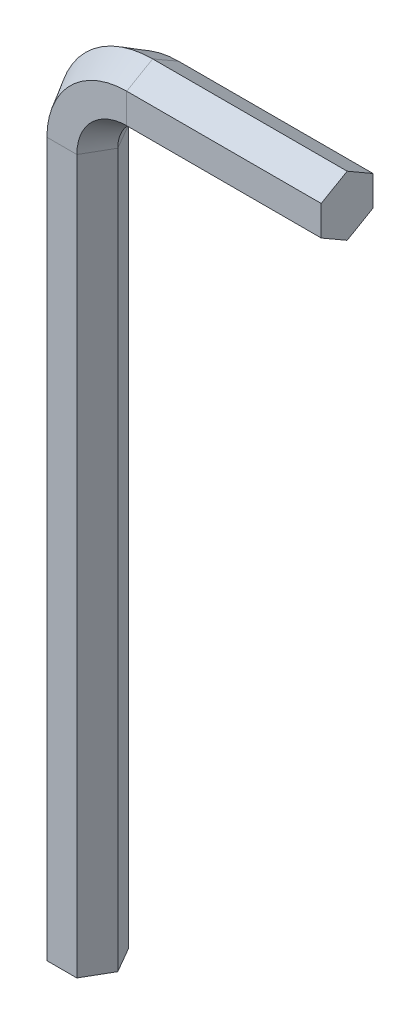
ISO-10303-21;
HEADER;
FILE_DESCRIPTION(('STEP AP214'),'2;1');
FILE_NAME('part.step','',(''),(''),'','','');
FILE_SCHEMA(('AUTOMOTIVE_DESIGN { 1 0 10303 214 1 1 1 1 }'));
ENDSEC;
DATA;
#1=APPLICATION_CONTEXT('core data for automotive mechanical design processes');
#2=APPLICATION_PROTOCOL_DEFINITION('international standard','automotive_design',2000,#1);
#3=PRODUCT_CONTEXT('',#1,'mechanical');
#4=PRODUCT('Part','Part','',(#3));
#5=PRODUCT_RELATED_PRODUCT_CATEGORY('part','',(#4));
#6=PRODUCT_DEFINITION_FORMATION('','',#4);
#7=PRODUCT_DEFINITION_CONTEXT('part definition',#1,'design');
#8=PRODUCT_DEFINITION('design','',#6,#7);
#9=PRODUCT_DEFINITION_SHAPE('','',#8);
#10=(LENGTH_UNIT() NAMED_UNIT(*) SI_UNIT(.MILLI.,.METRE.));
#11=(NAMED_UNIT(*) PLANE_ANGLE_UNIT() SI_UNIT($,.RADIAN.));
#12=(NAMED_UNIT(*) SI_UNIT($,.STERADIAN.) SOLID_ANGLE_UNIT());
#13=UNCERTAINTY_MEASURE_WITH_UNIT(LENGTH_MEASURE(1.E-05),#10,'distance_accuracy_value','');
#14=(GEOMETRIC_REPRESENTATION_CONTEXT(3) GLOBAL_UNCERTAINTY_ASSIGNED_CONTEXT((#13)) GLOBAL_UNIT_ASSIGNED_CONTEXT((#10,
#11,#12)) REPRESENTATION_CONTEXT('',''));
#15=CARTESIAN_POINT('',(0.,0.,0.));
#16=DIRECTION('',(0.,0.,1.));
#17=DIRECTION('',(1.,0.,0.));
#18=AXIS2_PLACEMENT_3D('',#15,#16,#17);
#19=CARTESIAN_POINT('',(0.,0.,0.));
#20=DIRECTION('',(0.,1.,0.));
#21=DIRECTION('',(0.,0.,1.));
#22=AXIS2_PLACEMENT_3D('',#19,#20,#21);
#23=PLANE('',#22);
#24=DIRECTION('',(0.499999999999997,0.,-0.86602540378444));
#25=VECTOR('',#24,1.);
#26=CARTESIAN_POINT('',(2.30940107675852,0.,3.99999999999999));
#27=LINE('',#26,#25);
#28=CARTESIAN_POINT('',(2.30940107675852,0.,3.99999999999999));
#29=VERTEX_POINT('',#28);
#30=CARTESIAN_POINT('',(4.61880215351701,0.,0.));
#31=VERTEX_POINT('',#30);
#32=EDGE_CURVE('E198',#29,#31,#27,.T.);
#33=ORIENTED_EDGE('',*,*,#32,.F.);
#34=DIRECTION('',(1.,0.,0.));
#35=VECTOR('',#34,1.);
#36=CARTESIAN_POINT('',(-2.30940107675849,0.,4.00000000000001));
#37=LINE('',#36,#35);
#38=CARTESIAN_POINT('',(-2.30940107675849,0.,4.00000000000001));
#39=VERTEX_POINT('',#38);
#40=EDGE_CURVE('E260',#39,#29,#37,.T.);
#41=ORIENTED_EDGE('',*,*,#40,.F.);
#42=DIRECTION('',(0.500000000000003,0.,0.866025403784437));
#43=VECTOR('',#42,1.);
#44=CARTESIAN_POINT('',(-4.61880215351701,0.,0.));
#45=LINE('',#44,#43);
#46=CARTESIAN_POINT('',(-4.61880215351701,0.,0.));
#47=VERTEX_POINT('',#46);
#48=EDGE_CURVE('E240',#47,#39,#45,.T.);
#49=ORIENTED_EDGE('',*,*,#48,.F.);
#50=DIRECTION('',(-0.499999999999996,0.,0.866025403784441));
#51=VECTOR('',#50,1.);
#52=CARTESIAN_POINT('',(-2.30940107675852,0.,-3.99999999999999));
#53=LINE('',#52,#51);
#54=CARTESIAN_POINT('',(-2.30940107675852,0.,-3.99999999999999));
#55=VERTEX_POINT('',#54);
#56=EDGE_CURVE('E145',#55,#47,#53,.T.);
#57=ORIENTED_EDGE('',*,*,#56,.F.);
#58=DIRECTION('',(-1.,0.,0.));
#59=VECTOR('',#58,1.);
#60=CARTESIAN_POINT('',(2.30940107675849,0.,-4.00000000000001));
#61=LINE('',#60,#59);
#62=CARTESIAN_POINT('',(2.30940107675849,0.,-4.00000000000001));
#63=VERTEX_POINT('',#62);
#64=EDGE_CURVE('E149',#63,#55,#61,.T.);
#65=ORIENTED_EDGE('',*,*,#64,.F.);
#66=DIRECTION('',(-0.500000000000003,0.,-0.866025403784437));
#67=VECTOR('',#66,1.);
#68=CARTESIAN_POINT('',(4.61880215351701,0.,0.));
#69=LINE('',#68,#67);
#70=EDGE_CURVE('E154',#31,#63,#69,.T.);
#71=ORIENTED_EDGE('',*,*,#70,.F.);
#72=EDGE_LOOP('',(#33,#41,#49,#57,#65,#71));
#73=FACE_BOUND('',#72,.T.);
#74=ADVANCED_FACE('F43',(#73),#23,.F.);
#75=CARTESIAN_POINT('',(40.,120.,0.));
#76=DIRECTION('',(1.,0.,0.));
#77=DIRECTION('',(0.,0.,1.));
#78=AXIS2_PLACEMENT_3D('',#75,#76,#77);
#79=PLANE('',#78);
#80=DIRECTION('',(0.,-0.499999999999997,-0.86602540378444));
#81=VECTOR('',#80,1.);
#82=CARTESIAN_POINT('',(40.,117.690598923241,3.99999999999999));
#83=LINE('',#82,#81);
#84=CARTESIAN_POINT('',(40.,117.690598923241,3.99999999999999));
#85=VERTEX_POINT('',#84);
#86=CARTESIAN_POINT('',(40.,115.381197846483,0.));
#87=VERTEX_POINT('',#86);
#88=EDGE_CURVE('E165',#85,#87,#83,.T.);
#89=ORIENTED_EDGE('',*,*,#88,.T.);
#90=DIRECTION('',(0.,0.500000000000003,-0.866025403784437));
#91=VECTOR('',#90,1.);
#92=CARTESIAN_POINT('',(40.,115.381197846483,0.));
#93=LINE('',#92,#91);
#94=CARTESIAN_POINT('',(40.,117.690598923242,-4.00000000000001));
#95=VERTEX_POINT('',#94);
#96=EDGE_CURVE('E168',#87,#95,#93,.T.);
#97=ORIENTED_EDGE('',*,*,#96,.T.);
#98=DIRECTION('',(0.,1.,0.));
#99=VECTOR('',#98,1.);
#100=CARTESIAN_POINT('',(40.,117.690598923242,-4.00000000000001));
#101=LINE('',#100,#99);
#102=CARTESIAN_POINT('',(40.,122.309401076759,-3.99999999999999));
#103=VERTEX_POINT('',#102);
#104=EDGE_CURVE('E218',#95,#103,#101,.T.);
#105=ORIENTED_EDGE('',*,*,#104,.T.);
#106=DIRECTION('',(0.,0.499999999999996,0.866025403784441));
#107=VECTOR('',#106,1.);
#108=CARTESIAN_POINT('',(40.,122.309401076759,-3.99999999999999));
#109=LINE('',#108,#107);
#110=CARTESIAN_POINT('',(40.,124.618802153517,0.));
#111=VERTEX_POINT('',#110);
#112=EDGE_CURVE('E63',#103,#111,#109,.T.);
#113=ORIENTED_EDGE('',*,*,#112,.T.);
#114=DIRECTION('',(0.,-0.500000000000003,0.866025403784437));
#115=VECTOR('',#114,1.);
#116=CARTESIAN_POINT('',(40.,124.618802153517,0.));
#117=LINE('',#116,#115);
#118=CARTESIAN_POINT('',(40.,122.309401076759,4.00000000000001));
#119=VERTEX_POINT('',#118);
#120=EDGE_CURVE('E57',#111,#119,#117,.T.);
#121=ORIENTED_EDGE('',*,*,#120,.T.);
#122=DIRECTION('',(0.,-1.,0.));
#123=VECTOR('',#122,1.);
#124=CARTESIAN_POINT('',(40.,122.309401076759,4.00000000000001));
#125=LINE('',#124,#123);
#126=EDGE_CURVE('E11',#119,#85,#125,.T.);
#127=ORIENTED_EDGE('',*,*,#126,.T.);
#128=EDGE_LOOP('',(#89,#97,#105,#113,#121,#127));
#129=FACE_BOUND('',#128,.T.);
#130=ADVANCED_FACE('F167',(#129),#79,.T.);
#131=CARTESIAN_POINT('',(2.30940107675852,0.,3.99999999999999));
#132=DIRECTION('',(0.86602540378444,0.,0.499999999999997));
#133=DIRECTION('',(0.499999999999997,0.,-0.86602540378444));
#134=AXIS2_PLACEMENT_3D('',#131,#132,#133);
#135=PLANE('',#134);
#136=DIRECTION('',(0.,1.,0.));
#137=VECTOR('',#136,1.);
#138=CARTESIAN_POINT('',(4.61880215351701,0.,0.));
#139=LINE('',#138,#137);
#140=CARTESIAN_POINT('',(4.61880215351701,110.,0.));
#141=VERTEX_POINT('',#140);
#142=EDGE_CURVE('E204',#31,#141,#139,.T.);
#143=ORIENTED_EDGE('',*,*,#142,.T.);
#144=DIRECTION('',(0.499999999999997,0.,-0.86602540378444));
#145=VECTOR('',#144,1.);
#146=CARTESIAN_POINT('',(2.30940107675852,110.,3.99999999999999));
#147=LINE('',#146,#145);
#148=CARTESIAN_POINT('',(2.30940107675852,110.,3.99999999999999));
#149=VERTEX_POINT('',#148);
#150=EDGE_CURVE('E305',#149,#141,#147,.T.);
#151=ORIENTED_EDGE('',*,*,#150,.F.);
#152=DIRECTION('',(0.,1.,0.));
#153=VECTOR('',#152,1.);
#154=CARTESIAN_POINT('',(2.30940107675852,0.,3.99999999999999));
#155=LINE('',#154,#153);
#156=EDGE_CURVE('E281',#29,#149,#155,.T.);
#157=ORIENTED_EDGE('',*,*,#156,.F.);
#158=ORIENTED_EDGE('',*,*,#32,.T.);
#159=EDGE_LOOP('',(#143,#151,#157,#158));
#160=FACE_BOUND('',#159,.T.);
#161=ADVANCED_FACE('F315',(#160),#135,.T.);
#162=CARTESIAN_POINT('',(4.61880215351701,0.,0.));
#163=DIRECTION('',(0.866025403784437,0.,-0.500000000000003));
#164=DIRECTION('',(-0.500000000000003,0.,-0.866025403784437));
#165=AXIS2_PLACEMENT_3D('',#162,#163,#164);
#166=PLANE('',#165);
#167=DIRECTION('',(0.,1.,0.));
#168=VECTOR('',#167,1.);
#169=CARTESIAN_POINT('',(2.30940107675849,0.,-4.00000000000001));
#170=LINE('',#169,#168);
#171=CARTESIAN_POINT('',(2.30940107675849,110.,-4.00000000000001));
#172=VERTEX_POINT('',#171);
#173=EDGE_CURVE('E203',#63,#172,#170,.T.);
#174=ORIENTED_EDGE('',*,*,#173,.T.);
#175=DIRECTION('',(-0.500000000000003,0.,-0.866025403784437));
#176=VECTOR('',#175,1.);
#177=CARTESIAN_POINT('',(4.61880215351701,110.,0.));
#178=LINE('',#177,#176);
#179=EDGE_CURVE('E199',#141,#172,#178,.T.);
#180=ORIENTED_EDGE('',*,*,#179,.F.);
#181=ORIENTED_EDGE('',*,*,#142,.F.);
#182=ORIENTED_EDGE('',*,*,#70,.T.);
#183=EDGE_LOOP('',(#174,#180,#181,#182));
#184=FACE_BOUND('',#183,.T.);
#185=ADVANCED_FACE('F318',(#184),#166,.T.);
#186=CARTESIAN_POINT('',(2.30940107675849,0.,-4.00000000000001));
#187=DIRECTION('',(0.,0.,-1.));
#188=DIRECTION('',(-1.,0.,0.));
#189=AXIS2_PLACEMENT_3D('',#186,#187,#188);
#190=PLANE('',#189);
#191=DIRECTION('',(0.,1.,0.));
#192=VECTOR('',#191,1.);
#193=CARTESIAN_POINT('',(-2.30940107675852,0.,-3.99999999999999));
#194=LINE('',#193,#192);
#195=CARTESIAN_POINT('',(-2.30940107675852,110.,-3.99999999999999));
#196=VERTEX_POINT('',#195);
#197=EDGE_CURVE('E223',#55,#196,#194,.T.);
#198=ORIENTED_EDGE('',*,*,#197,.T.);
#199=DIRECTION('',(-1.,0.,0.));
#200=VECTOR('',#199,1.);
#201=CARTESIAN_POINT('',(2.30940107675849,110.,-4.00000000000001));
#202=LINE('',#201,#200);
#203=EDGE_CURVE('E208',#172,#196,#202,.T.);
#204=ORIENTED_EDGE('',*,*,#203,.F.);
#205=ORIENTED_EDGE('',*,*,#173,.F.);
#206=ORIENTED_EDGE('',*,*,#64,.T.);
#207=EDGE_LOOP('',(#198,#204,#205,#206));
#208=FACE_BOUND('',#207,.T.);
#209=ADVANCED_FACE('F375',(#208),#190,.T.);
#210=CARTESIAN_POINT('',(-2.30940107675852,0.,-3.99999999999999));
#211=DIRECTION('',(-0.866025403784441,0.,-0.499999999999996));
#212=DIRECTION('',(-0.499999999999996,0.,0.866025403784441));
#213=AXIS2_PLACEMENT_3D('',#210,#211,#212);
#214=PLANE('',#213);
#215=DIRECTION('',(0.,1.,0.));
#216=VECTOR('',#215,1.);
#217=CARTESIAN_POINT('',(-4.61880215351701,0.,0.));
#218=LINE('',#217,#216);
#219=CARTESIAN_POINT('',(-4.61880215351701,110.,0.));
#220=VERTEX_POINT('',#219);
#221=EDGE_CURVE('E243',#47,#220,#218,.T.);
#222=ORIENTED_EDGE('',*,*,#221,.T.);
#223=DIRECTION('',(-0.499999999999996,0.,0.866025403784441));
#224=VECTOR('',#223,1.);
#225=CARTESIAN_POINT('',(-2.30940107675852,110.,-3.99999999999999));
#226=LINE('',#225,#224);
#227=EDGE_CURVE('E227',#196,#220,#226,.T.);
#228=ORIENTED_EDGE('',*,*,#227,.F.);
#229=ORIENTED_EDGE('',*,*,#197,.F.);
#230=ORIENTED_EDGE('',*,*,#56,.T.);
#231=EDGE_LOOP('',(#222,#228,#229,#230));
#232=FACE_BOUND('',#231,.T.);
#233=ADVANCED_FACE('F384',(#232),#214,.T.);
#234=CARTESIAN_POINT('',(-4.61880215351701,0.,0.));
#235=DIRECTION('',(-0.866025403784437,0.,0.500000000000003));
#236=DIRECTION('',(0.500000000000003,0.,0.866025403784437));
#237=AXIS2_PLACEMENT_3D('',#234,#235,#236);
#238=PLANE('',#237);
#239=DIRECTION('',(0.,1.,0.));
#240=VECTOR('',#239,1.);
#241=CARTESIAN_POINT('',(-2.30940107675849,0.,4.00000000000001));
#242=LINE('',#241,#240);
#243=CARTESIAN_POINT('',(-2.30940107675849,110.,4.00000000000001));
#244=VERTEX_POINT('',#243);
#245=EDGE_CURVE('E263',#39,#244,#242,.T.);
#246=ORIENTED_EDGE('',*,*,#245,.T.);
#247=DIRECTION('',(0.500000000000003,0.,0.866025403784437));
#248=VECTOR('',#247,1.);
#249=CARTESIAN_POINT('',(-4.61880215351701,110.,0.));
#250=LINE('',#249,#248);
#251=EDGE_CURVE('E247',#220,#244,#250,.T.);
#252=ORIENTED_EDGE('',*,*,#251,.F.);
#253=ORIENTED_EDGE('',*,*,#221,.F.);
#254=ORIENTED_EDGE('',*,*,#48,.T.);
#255=EDGE_LOOP('',(#246,#252,#253,#254));
#256=FACE_BOUND('',#255,.T.);
#257=ADVANCED_FACE('F395',(#256),#238,.T.);
#258=CARTESIAN_POINT('',(-2.30940107675849,0.,4.00000000000001));
#259=DIRECTION('',(0.,0.,1.));
#260=DIRECTION('',(1.,0.,0.));
#261=AXIS2_PLACEMENT_3D('',#258,#259,#260);
#262=PLANE('',#261);
#263=DIRECTION('',(1.,0.,0.));
#264=VECTOR('',#263,1.);
#265=CARTESIAN_POINT('',(-2.30940107675849,110.,4.00000000000001));
#266=LINE('',#265,#264);
#267=EDGE_CURVE('E267',#244,#149,#266,.T.);
#268=ORIENTED_EDGE('',*,*,#267,.F.);
#269=ORIENTED_EDGE('',*,*,#245,.F.);
#270=ORIENTED_EDGE('',*,*,#40,.T.);
#271=ORIENTED_EDGE('',*,*,#156,.T.);
#272=EDGE_LOOP('',(#268,#269,#270,#271));
#273=FACE_BOUND('',#272,.T.);
#274=ADVANCED_FACE('F331',(#273),#262,.T.);
#275=CARTESIAN_POINT('',(10.,110.,3.99999999999999));
#276=DIRECTION('',(0.,0.,1.));
#277=DIRECTION('',(1.,0.,0.));
#278=AXIS2_PLACEMENT_3D('',#275,#276,#277);
#279=CONICAL_SURFACE('',#278,7.69059892324148,0.523598775598296);
#280=CARTESIAN_POINT('',(10.,110.,0.));
#281=DIRECTION('',(0.,0.,-1.));
#282=DIRECTION('',(-1.,0.,0.));
#283=AXIS2_PLACEMENT_3D('',#280,#281,#282);
#284=CIRCLE('',#283,5.38119784648299);
#285=CARTESIAN_POINT('',(10.,115.381197846483,0.));
#286=VERTEX_POINT('',#285);
#287=EDGE_CURVE('E212',#141,#286,#284,.T.);
#288=ORIENTED_EDGE('',*,*,#287,.T.);
#289=DIRECTION('',(0.,-0.499999999999997,-0.86602540378444));
#290=VECTOR('',#289,1.);
#291=CARTESIAN_POINT('',(10.0000000000001,117.690598923241,3.99999999999999));
#292=LINE('',#291,#290);
#293=CARTESIAN_POINT('',(10.0000000000001,117.690598923241,3.99999999999999));
#294=VERTEX_POINT('',#293);
#295=EDGE_CURVE('E188',#294,#286,#292,.T.);
#296=ORIENTED_EDGE('',*,*,#295,.F.);
#297=CARTESIAN_POINT('',(10.,110.,3.99999999999999));
#298=DIRECTION('',(0.,0.,-1.));
#299=DIRECTION('',(-1.,0.,0.));
#300=AXIS2_PLACEMENT_3D('',#297,#298,#299);
#301=CIRCLE('',#300,7.69059892324148);
#302=EDGE_CURVE('E284',#149,#294,#301,.T.);
#303=ORIENTED_EDGE('',*,*,#302,.F.);
#304=ORIENTED_EDGE('',*,*,#150,.T.);
#305=EDGE_LOOP('',(#288,#296,#303,#304));
#306=FACE_BOUND('',#305,.T.);
#307=ADVANCED_FACE('F291',(#306),#279,.F.);
#308=CARTESIAN_POINT('',(10.,110.,0.));
#309=DIRECTION('',(0.,0.,-1.));
#310=DIRECTION('',(-1.,0.,0.));
#311=AXIS2_PLACEMENT_3D('',#308,#309,#310);
#312=CONICAL_SURFACE('',#311,5.38119784648299,0.523598775598303);
#313=CARTESIAN_POINT('',(10.,110.,-4.00000000000001));
#314=DIRECTION('',(0.,0.,-1.));
#315=DIRECTION('',(-1.,0.,0.));
#316=AXIS2_PLACEMENT_3D('',#313,#314,#315);
#317=CIRCLE('',#316,7.69059892324151);
#318=CARTESIAN_POINT('',(10.0000000000001,117.690598923242,-4.00000000000001));
#319=VERTEX_POINT('',#318);
#320=EDGE_CURVE('E132',#172,#319,#317,.T.);
#321=ORIENTED_EDGE('',*,*,#320,.T.);
#322=DIRECTION('',(0.,0.500000000000003,-0.866025403784437));
#323=VECTOR('',#322,1.);
#324=CARTESIAN_POINT('',(10.,115.381197846483,0.));
#325=LINE('',#324,#323);
#326=EDGE_CURVE('E209',#286,#319,#325,.T.);
#327=ORIENTED_EDGE('',*,*,#326,.F.);
#328=ORIENTED_EDGE('',*,*,#287,.F.);
#329=ORIENTED_EDGE('',*,*,#179,.T.);
#330=EDGE_LOOP('',(#321,#327,#328,#329));
#331=FACE_BOUND('',#330,.T.);
#332=ADVANCED_FACE('F321',(#331),#312,.F.);
#333=CARTESIAN_POINT('',(2.30940107675849,110.,-4.));
#334=DIRECTION('',(0.,0.,-1.));
#335=DIRECTION('',(-1.,0.,0.));
#336=AXIS2_PLACEMENT_3D('',#333,#334,#335);
#337=PLANE('',#336);
#338=CARTESIAN_POINT('',(10.,110.,-3.99999999999999));
#339=DIRECTION('',(0.,0.,-1.));
#340=DIRECTION('',(-1.,0.,0.));
#341=AXIS2_PLACEMENT_3D('',#338,#339,#340);
#342=CIRCLE('',#341,12.3094010767585);
#343=CARTESIAN_POINT('',(10.0000000000001,122.309401076759,-3.99999999999999));
#344=VERTEX_POINT('',#343);
#345=EDGE_CURVE('E123',#196,#344,#342,.T.);
#346=ORIENTED_EDGE('',*,*,#345,.T.);
#347=DIRECTION('',(0.,1.,0.));
#348=VECTOR('',#347,1.);
#349=CARTESIAN_POINT('',(10.0000000000001,117.690598923242,-4.00000000000001));
#350=LINE('',#349,#348);
#351=EDGE_CURVE('E214',#319,#344,#350,.T.);
#352=ORIENTED_EDGE('',*,*,#351,.F.);
#353=ORIENTED_EDGE('',*,*,#320,.F.);
#354=ORIENTED_EDGE('',*,*,#203,.T.);
#355=EDGE_LOOP('',(#346,#352,#353,#354));
#356=FACE_BOUND('',#355,.T.);
#357=ADVANCED_FACE('F323',(#356),#337,.T.);
#358=CARTESIAN_POINT('',(10.,110.,-3.99999999999999));
#359=DIRECTION('',(0.,0.,1.));
#360=DIRECTION('',(1.,0.,0.));
#361=AXIS2_PLACEMENT_3D('',#358,#359,#360);
#362=CONICAL_SURFACE('',#361,12.3094010767585,0.523598775598295);
#363=CARTESIAN_POINT('',(10.,110.,0.));
#364=DIRECTION('',(0.,0.,-1.));
#365=DIRECTION('',(-1.,0.,0.));
#366=AXIS2_PLACEMENT_3D('',#363,#364,#365);
#367=CIRCLE('',#366,14.618802153517);
#368=CARTESIAN_POINT('',(10.0000000000001,124.618802153517,0.));
#369=VERTEX_POINT('',#368);
#370=EDGE_CURVE('E116',#220,#369,#367,.T.);
#371=ORIENTED_EDGE('',*,*,#370,.T.);
#372=DIRECTION('',(0.,0.499999999999996,0.866025403784441));
#373=VECTOR('',#372,1.);
#374=CARTESIAN_POINT('',(10.0000000000001,122.309401076759,-3.99999999999999));
#375=LINE('',#374,#373);
#376=EDGE_CURVE('E233',#344,#369,#375,.T.);
#377=ORIENTED_EDGE('',*,*,#376,.F.);
#378=ORIENTED_EDGE('',*,*,#345,.F.);
#379=ORIENTED_EDGE('',*,*,#227,.T.);
#380=EDGE_LOOP('',(#371,#377,#378,#379));
#381=FACE_BOUND('',#380,.T.);
#382=ADVANCED_FACE('F329',(#381),#362,.T.);
#383=CARTESIAN_POINT('',(10.,110.,0.));
#384=DIRECTION('',(0.,0.,-1.));
#385=DIRECTION('',(-1.,0.,0.));
#386=AXIS2_PLACEMENT_3D('',#383,#384,#385);
#387=CONICAL_SURFACE('',#386,14.618802153517,0.523598775598302);
#388=CARTESIAN_POINT('',(10.,110.,4.00000000000001));
#389=DIRECTION('',(0.,0.,-1.));
#390=DIRECTION('',(-1.,0.,0.));
#391=AXIS2_PLACEMENT_3D('',#388,#389,#390);
#392=CIRCLE('',#391,12.3094010767585);
#393=CARTESIAN_POINT('',(10.0000000000001,122.309401076759,4.00000000000001));
#394=VERTEX_POINT('',#393);
#395=EDGE_CURVE('E270',#244,#394,#392,.T.);
#396=ORIENTED_EDGE('',*,*,#395,.T.);
#397=DIRECTION('',(0.,-0.500000000000003,0.866025403784437));
#398=VECTOR('',#397,1.);
#399=CARTESIAN_POINT('',(10.0000000000001,124.618802153517,0.));
#400=LINE('',#399,#398);
#401=EDGE_CURVE('E252',#369,#394,#400,.T.);
#402=ORIENTED_EDGE('',*,*,#401,.F.);
#403=ORIENTED_EDGE('',*,*,#370,.F.);
#404=ORIENTED_EDGE('',*,*,#251,.T.);
#405=EDGE_LOOP('',(#396,#402,#403,#404));
#406=FACE_BOUND('',#405,.T.);
#407=ADVANCED_FACE('F444',(#406),#387,.T.);
#408=CARTESIAN_POINT('',(-2.30940107675849,110.,4.));
#409=DIRECTION('',(0.,0.,1.));
#410=DIRECTION('',(1.,0.,0.));
#411=AXIS2_PLACEMENT_3D('',#408,#409,#410);
#412=PLANE('',#411);
#413=DIRECTION('',(0.,-1.,0.));
#414=VECTOR('',#413,1.);
#415=CARTESIAN_POINT('',(10.0000000000001,122.309401076759,4.00000000000001));
#416=LINE('',#415,#414);
#417=EDGE_CURVE('E195',#394,#294,#416,.T.);
#418=ORIENTED_EDGE('',*,*,#417,.F.);
#419=ORIENTED_EDGE('',*,*,#395,.F.);
#420=ORIENTED_EDGE('',*,*,#267,.T.);
#421=ORIENTED_EDGE('',*,*,#302,.T.);
#422=EDGE_LOOP('',(#418,#419,#420,#421));
#423=FACE_BOUND('',#422,.T.);
#424=ADVANCED_FACE('F295',(#423),#412,.T.);
#425=CARTESIAN_POINT('',(10.0000000000001,117.690598923241,3.99999999999999));
#426=DIRECTION('',(0.,-0.86602540378444,0.499999999999997));
#427=DIRECTION('',(0.,-0.499999999999997,-0.86602540378444));
#428=AXIS2_PLACEMENT_3D('',#425,#426,#427);
#429=PLANE('',#428);
#430=DIRECTION('',(1.,0.,0.));
#431=VECTOR('',#430,1.);
#432=CARTESIAN_POINT('',(10.0000000000001,115.381197846483,0.));
#433=LINE('',#432,#431);
#434=EDGE_CURVE('E174',#286,#87,#433,.T.);
#435=ORIENTED_EDGE('',*,*,#434,.T.);
#436=ORIENTED_EDGE('',*,*,#88,.F.);
#437=DIRECTION('',(1.,0.,0.));
#438=VECTOR('',#437,1.);
#439=CARTESIAN_POINT('',(10.0000000000001,117.690598923241,3.99999999999999));
#440=LINE('',#439,#438);
#441=EDGE_CURVE('E175',#294,#85,#440,.T.);
#442=ORIENTED_EDGE('',*,*,#441,.F.);
#443=ORIENTED_EDGE('',*,*,#295,.T.);
#444=EDGE_LOOP('',(#435,#436,#442,#443));
#445=FACE_BOUND('',#444,.T.);
#446=ADVANCED_FACE('F186',(#445),#429,.T.);
#447=CARTESIAN_POINT('',(10.0000000000001,115.381197846483,0.));
#448=DIRECTION('',(0.,-0.866025403784437,-0.500000000000003));
#449=DIRECTION('',(0.,0.500000000000003,-0.866025403784437));
#450=AXIS2_PLACEMENT_3D('',#447,#448,#449);
#451=PLANE('',#450);
#452=DIRECTION('',(1.,0.,0.));
#453=VECTOR('',#452,1.);
#454=CARTESIAN_POINT('',(10.0000000000001,117.690598923242,-4.00000000000001));
#455=LINE('',#454,#453);
#456=EDGE_CURVE('E182',#319,#95,#455,.T.);
#457=ORIENTED_EDGE('',*,*,#456,.T.);
#458=ORIENTED_EDGE('',*,*,#96,.F.);
#459=ORIENTED_EDGE('',*,*,#434,.F.);
#460=ORIENTED_EDGE('',*,*,#326,.T.);
#461=EDGE_LOOP('',(#457,#458,#459,#460));
#462=FACE_BOUND('',#461,.T.);
#463=ADVANCED_FACE('F179',(#462),#451,.T.);
#464=CARTESIAN_POINT('',(10.0000000000001,117.690598923242,-4.00000000000001));
#465=DIRECTION('',(0.,0.,-1.));
#466=DIRECTION('',(0.,1.,0.));
#467=AXIS2_PLACEMENT_3D('',#464,#465,#466);
#468=PLANE('',#467);
#469=DIRECTION('',(1.,0.,0.));
#470=VECTOR('',#469,1.);
#471=CARTESIAN_POINT('',(10.0000000000001,122.309401076759,-3.99999999999999));
#472=LINE('',#471,#470);
#473=EDGE_CURVE('E101',#344,#103,#472,.T.);
#474=ORIENTED_EDGE('',*,*,#473,.T.);
#475=ORIENTED_EDGE('',*,*,#104,.F.);
#476=ORIENTED_EDGE('',*,*,#456,.F.);
#477=ORIENTED_EDGE('',*,*,#351,.T.);
#478=EDGE_LOOP('',(#474,#475,#476,#477));
#479=FACE_BOUND('',#478,.T.);
#480=ADVANCED_FACE('F480',(#479),#468,.T.);
#481=CARTESIAN_POINT('',(10.0000000000001,122.309401076759,-3.99999999999999));
#482=DIRECTION('',(0.,0.866025403784441,-0.499999999999996));
#483=DIRECTION('',(0.,0.499999999999996,0.866025403784441));
#484=AXIS2_PLACEMENT_3D('',#481,#482,#483);
#485=PLANE('',#484);
#486=DIRECTION('',(1.,0.,0.));
#487=VECTOR('',#486,1.);
#488=CARTESIAN_POINT('',(10.0000000000001,124.618802153517,0.));
#489=LINE('',#488,#487);
#490=EDGE_CURVE('E93',#369,#111,#489,.T.);
#491=ORIENTED_EDGE('',*,*,#490,.T.);
#492=ORIENTED_EDGE('',*,*,#112,.F.);
#493=ORIENTED_EDGE('',*,*,#473,.F.);
#494=ORIENTED_EDGE('',*,*,#376,.T.);
#495=EDGE_LOOP('',(#491,#492,#493,#494));
#496=FACE_BOUND('',#495,.T.);
#497=ADVANCED_FACE('F341',(#496),#485,.T.);
#498=CARTESIAN_POINT('',(10.0000000000001,124.618802153517,0.));
#499=DIRECTION('',(0.,0.866025403784437,0.500000000000003));
#500=DIRECTION('',(0.,-0.500000000000003,0.866025403784437));
#501=AXIS2_PLACEMENT_3D('',#498,#499,#500);
#502=PLANE('',#501);
#503=DIRECTION('',(1.,0.,0.));
#504=VECTOR('',#503,1.);
#505=CARTESIAN_POINT('',(10.0000000000001,122.309401076759,4.00000000000001));
#506=LINE('',#505,#504);
#507=EDGE_CURVE('E51',#394,#119,#506,.T.);
#508=ORIENTED_EDGE('',*,*,#507,.T.);
#509=ORIENTED_EDGE('',*,*,#120,.F.);
#510=ORIENTED_EDGE('',*,*,#490,.F.);
#511=ORIENTED_EDGE('',*,*,#401,.T.);
#512=EDGE_LOOP('',(#508,#509,#510,#511));
#513=FACE_BOUND('',#512,.T.);
#514=ADVANCED_FACE('F336',(#513),#502,.T.);
#515=CARTESIAN_POINT('',(10.0000000000001,122.309401076759,4.00000000000001));
#516=DIRECTION('',(0.,0.,1.));
#517=DIRECTION('',(0.,-1.,0.));
#518=AXIS2_PLACEMENT_3D('',#515,#516,#517);
#519=PLANE('',#518);
#520=ORIENTED_EDGE('',*,*,#126,.F.);
#521=ORIENTED_EDGE('',*,*,#507,.F.);
#522=ORIENTED_EDGE('',*,*,#417,.T.);
#523=ORIENTED_EDGE('',*,*,#441,.T.);
#524=EDGE_LOOP('',(#520,#521,#522,#523));
#525=FACE_BOUND('',#524,.T.);
#526=ADVANCED_FACE('F286',(#525),#519,.T.);
#527=CLOSED_SHELL('',(#74,#130,#161,#185,#209,#233,#257,#274,#307,#332,#357,#382,#407,#424,#446,
#463,#480,#497,#514,#526));
#528=MANIFOLD_SOLID_BREP('B2',#527);
#529=ADVANCED_BREP_SHAPE_REPRESENTATION('',(#18,#528),#14);
#530=SHAPE_DEFINITION_REPRESENTATION(#9,#529);
ENDSEC;
END-ISO-10303-21;
